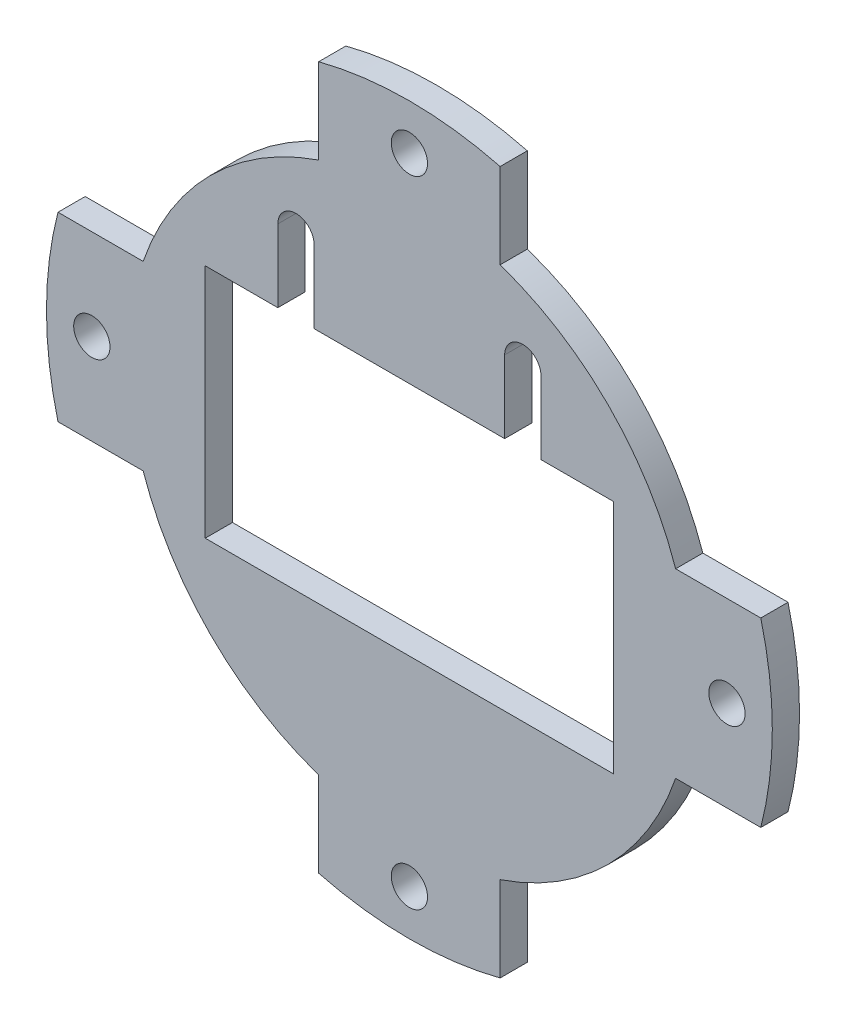
ISO-10303-21;
HEADER;
FILE_DESCRIPTION(('STEP AP214'),'2;1');
FILE_NAME('part.step','',(''),(''),'','','');
FILE_SCHEMA(('AUTOMOTIVE_DESIGN { 1 0 10303 214 1 1 1 1 }'));
ENDSEC;
DATA;
#1=APPLICATION_CONTEXT('core data for automotive mechanical design processes');
#2=APPLICATION_PROTOCOL_DEFINITION('international standard','automotive_design',2000,#1);
#3=PRODUCT_CONTEXT('',#1,'mechanical');
#4=PRODUCT('Part','Part','',(#3));
#5=PRODUCT_RELATED_PRODUCT_CATEGORY('part','',(#4));
#6=PRODUCT_DEFINITION_FORMATION('','',#4);
#7=PRODUCT_DEFINITION_CONTEXT('part definition',#1,'design');
#8=PRODUCT_DEFINITION('design','',#6,#7);
#9=PRODUCT_DEFINITION_SHAPE('','',#8);
#10=(LENGTH_UNIT() NAMED_UNIT(*) SI_UNIT(.MILLI.,.METRE.));
#11=(NAMED_UNIT(*) PLANE_ANGLE_UNIT() SI_UNIT($,.RADIAN.));
#12=(NAMED_UNIT(*) SI_UNIT($,.STERADIAN.) SOLID_ANGLE_UNIT());
#13=UNCERTAINTY_MEASURE_WITH_UNIT(LENGTH_MEASURE(1.E-05),#10,'distance_accuracy_value','');
#14=(GEOMETRIC_REPRESENTATION_CONTEXT(3) GLOBAL_UNCERTAINTY_ASSIGNED_CONTEXT((#13)) GLOBAL_UNIT_ASSIGNED_CONTEXT((#10,
#11,#12)) REPRESENTATION_CONTEXT('',''));
#15=CARTESIAN_POINT('',(0.,0.,0.));
#16=DIRECTION('',(0.,0.,1.));
#17=DIRECTION('',(1.,0.,0.));
#18=AXIS2_PLACEMENT_3D('',#15,#16,#17);
#19=CARTESIAN_POINT('',(22.5,13.,-0.00100000000000013));
#20=DIRECTION('',(0.,1.,0.));
#21=DIRECTION('',(-1.,0.,0.));
#22=AXIS2_PLACEMENT_3D('',#19,#20,#21);
#23=PLANE('',#22);
#24=DIRECTION('',(-1.,0.,0.));
#25=VECTOR('',#24,1.);
#26=CARTESIAN_POINT('',(22.5,13.,3.));
#27=LINE('',#26,#25);
#28=CARTESIAN_POINT('',(10.5,13.,3.));
#29=VERTEX_POINT('',#28);
#30=CARTESIAN_POINT('',(-10.5,13.,3.));
#31=VERTEX_POINT('',#30);
#32=EDGE_CURVE('E302',#29,#31,#27,.T.);
#33=ORIENTED_EDGE('',*,*,#32,.T.);
#34=DIRECTION('',(0.,0.,1.));
#35=VECTOR('',#34,1.);
#36=CARTESIAN_POINT('',(-10.5,13.,-0.00100000000000013));
#37=LINE('',#36,#35);
#38=CARTESIAN_POINT('',(-10.5,13.,0.));
#39=VERTEX_POINT('',#38);
#40=EDGE_CURVE('E259',#39,#31,#37,.T.);
#41=ORIENTED_EDGE('',*,*,#40,.F.);
#42=DIRECTION('',(1.,0.,0.));
#43=VECTOR('',#42,1.);
#44=CARTESIAN_POINT('',(22.5,13.,0.));
#45=LINE('',#44,#43);
#46=CARTESIAN_POINT('',(10.5,13.,0.));
#47=VERTEX_POINT('',#46);
#48=EDGE_CURVE('E286',#39,#47,#45,.T.);
#49=ORIENTED_EDGE('',*,*,#48,.T.);
#50=DIRECTION('',(0.,0.,1.));
#51=VECTOR('',#50,1.);
#52=CARTESIAN_POINT('',(10.5,13.,-0.00100000000000013));
#53=LINE('',#52,#51);
#54=EDGE_CURVE('E278',#47,#29,#53,.T.);
#55=ORIENTED_EDGE('',*,*,#54,.T.);
#56=EDGE_LOOP('',(#33,#41,#49,#55));
#57=FACE_BOUND('',#56,.T.);
#58=ADVANCED_FACE('F33',(#57),#23,.F.);
#59=CARTESIAN_POINT('',(22.5,13.,3.));
#60=VERTEX_POINT('',#59);
#61=CARTESIAN_POINT('',(14.5,13.,3.));
#62=VERTEX_POINT('',#61);
#63=EDGE_CURVE('E298',#60,#62,#27,.T.);
#64=ORIENTED_EDGE('',*,*,#63,.T.);
#65=DIRECTION('',(0.,0.,1.));
#66=VECTOR('',#65,1.);
#67=CARTESIAN_POINT('',(14.5,13.,-0.00100000000000013));
#68=LINE('',#67,#66);
#69=CARTESIAN_POINT('',(14.5,13.,0.));
#70=VERTEX_POINT('',#69);
#71=EDGE_CURVE('E276',#70,#62,#68,.T.);
#72=ORIENTED_EDGE('',*,*,#71,.F.);
#73=CARTESIAN_POINT('',(22.5,13.,0.));
#74=VERTEX_POINT('',#73);
#75=EDGE_CURVE('E282',#70,#74,#45,.T.);
#76=ORIENTED_EDGE('',*,*,#75,.T.);
#77=DIRECTION('',(0.,0.,1.));
#78=VECTOR('',#77,1.);
#79=CARTESIAN_POINT('',(22.5,13.,-0.00100000000000013));
#80=LINE('',#79,#78);
#81=EDGE_CURVE('E307',#74,#60,#80,.T.);
#82=ORIENTED_EDGE('',*,*,#81,.T.);
#83=EDGE_LOOP('',(#64,#72,#76,#82));
#84=FACE_BOUND('',#83,.T.);
#85=ADVANCED_FACE('F452',(#84),#23,.F.);
#86=CARTESIAN_POINT('',(0.,0.,3.));
#87=DIRECTION('',(0.,0.,-1.));
#88=DIRECTION('',(-1.,0.,0.));
#89=AXIS2_PLACEMENT_3D('',#86,#87,#88);
#90=CYLINDRICAL_SURFACE('',#89,40.);
#91=CARTESIAN_POINT('',(0.,0.,0.));
#92=DIRECTION('',(0.,0.,1.));
#93=DIRECTION('',(1.,0.,0.));
#94=AXIS2_PLACEMENT_3D('',#91,#92,#93);
#95=CIRCLE('',#94,40.);
#96=CARTESIAN_POINT('',(10.,38.7298334620742,0.));
#97=VERTEX_POINT('',#96);
#98=CARTESIAN_POINT('',(-10.,38.7298334620742,0.));
#99=VERTEX_POINT('',#98);
#100=EDGE_CURVE('E315',#97,#99,#95,.T.);
#101=ORIENTED_EDGE('',*,*,#100,.T.);
#102=DIRECTION('',(0.,0.,-1.));
#103=VECTOR('',#102,1.);
#104=CARTESIAN_POINT('',(-10.,38.7298334620742,3.));
#105=LINE('',#104,#103);
#106=CARTESIAN_POINT('',(-10.,38.7298334620742,3.));
#107=VERTEX_POINT('',#106);
#108=EDGE_CURVE('E11',#107,#99,#105,.T.);
#109=ORIENTED_EDGE('',*,*,#108,.F.);
#110=CARTESIAN_POINT('',(0.,0.,3.));
#111=DIRECTION('',(0.,0.,1.));
#112=DIRECTION('',(1.,0.,0.));
#113=AXIS2_PLACEMENT_3D('',#110,#111,#112);
#114=CIRCLE('',#113,40.);
#115=CARTESIAN_POINT('',(10.,38.7298334620742,3.));
#116=VERTEX_POINT('',#115);
#117=EDGE_CURVE('E316',#116,#107,#114,.T.);
#118=ORIENTED_EDGE('',*,*,#117,.F.);
#119=DIRECTION('',(0.,0.,-1.));
#120=VECTOR('',#119,1.);
#121=CARTESIAN_POINT('',(10.,38.7298334620742,3.));
#122=LINE('',#121,#120);
#123=EDGE_CURVE('E350',#116,#97,#122,.T.);
#124=ORIENTED_EDGE('',*,*,#123,.T.);
#125=EDGE_LOOP('',(#101,#109,#118,#124));
#126=FACE_BOUND('',#125,.T.);
#127=ADVANCED_FACE('F35',(#126),#90,.T.);
#128=CARTESIAN_POINT('',(-10.,29.3428015022424,3.));
#129=DIRECTION('',(1.,0.,0.));
#130=DIRECTION('',(0.,0.,-1.));
#131=AXIS2_PLACEMENT_3D('',#128,#129,#130);
#132=PLANE('',#131);
#133=DIRECTION('',(0.,-1.,0.));
#134=VECTOR('',#133,1.);
#135=CARTESIAN_POINT('',(-10.,29.3428015022424,0.));
#136=LINE('',#135,#134);
#137=CARTESIAN_POINT('',(-10.,29.3428015022424,0.));
#138=VERTEX_POINT('',#137);
#139=EDGE_CURVE('E353',#99,#138,#136,.T.);
#140=ORIENTED_EDGE('',*,*,#139,.T.);
#141=DIRECTION('',(0.,0.,-1.));
#142=VECTOR('',#141,1.);
#143=CARTESIAN_POINT('',(-10.,29.3428015022424,3.));
#144=LINE('',#143,#142);
#145=CARTESIAN_POINT('',(-10.,29.3428015022424,3.));
#146=VERTEX_POINT('',#145);
#147=EDGE_CURVE('E42',#146,#138,#144,.T.);
#148=ORIENTED_EDGE('',*,*,#147,.F.);
#149=DIRECTION('',(0.,-1.,0.));
#150=VECTOR('',#149,1.);
#151=CARTESIAN_POINT('',(-10.,29.3428015022424,3.));
#152=LINE('',#151,#150);
#153=EDGE_CURVE('E319',#107,#146,#152,.T.);
#154=ORIENTED_EDGE('',*,*,#153,.F.);
#155=ORIENTED_EDGE('',*,*,#108,.T.);
#156=EDGE_LOOP('',(#140,#148,#154,#155));
#157=FACE_BOUND('',#156,.T.);
#158=ADVANCED_FACE('F601',(#157),#132,.F.);
#159=CARTESIAN_POINT('',(0.,0.,3.));
#160=DIRECTION('',(0.,0.,-1.));
#161=DIRECTION('',(-1.,0.,0.));
#162=AXIS2_PLACEMENT_3D('',#159,#160,#161);
#163=CYLINDRICAL_SURFACE('',#162,31.);
#164=CARTESIAN_POINT('',(0.,0.,0.));
#165=DIRECTION('',(0.,0.,1.));
#166=DIRECTION('',(1.,0.,0.));
#167=AXIS2_PLACEMENT_3D('',#164,#165,#166);
#168=CIRCLE('',#167,31.);
#169=CARTESIAN_POINT('',(-29.3428015022423,10.0000000000003,0.));
#170=VERTEX_POINT('',#169);
#171=EDGE_CURVE('E355',#138,#170,#168,.T.);
#172=ORIENTED_EDGE('',*,*,#171,.T.);
#173=DIRECTION('',(0.,0.,-1.));
#174=VECTOR('',#173,1.);
#175=CARTESIAN_POINT('',(-29.3428015022423,10.0000000000003,3.));
#176=LINE('',#175,#174);
#177=CARTESIAN_POINT('',(-29.3428015022423,10.0000000000003,3.));
#178=VERTEX_POINT('',#177);
#179=EDGE_CURVE('E420',#178,#170,#176,.T.);
#180=ORIENTED_EDGE('',*,*,#179,.F.);
#181=CARTESIAN_POINT('',(0.,0.,3.));
#182=DIRECTION('',(0.,0.,1.));
#183=DIRECTION('',(1.,0.,0.));
#184=AXIS2_PLACEMENT_3D('',#181,#182,#183);
#185=CIRCLE('',#184,31.);
#186=EDGE_CURVE('E322',#146,#178,#185,.T.);
#187=ORIENTED_EDGE('',*,*,#186,.F.);
#188=ORIENTED_EDGE('',*,*,#147,.T.);
#189=EDGE_LOOP('',(#172,#180,#187,#188));
#190=FACE_BOUND('',#189,.T.);
#191=ADVANCED_FACE('F598',(#190),#163,.T.);
#192=CARTESIAN_POINT('',(-29.3428015022423,10.0000000000003,3.));
#193=DIRECTION('',(0.,-1.,0.));
#194=DIRECTION('',(1.,0.,0.));
#195=AXIS2_PLACEMENT_3D('',#192,#193,#194);
#196=PLANE('',#195);
#197=DIRECTION('',(-1.,0.,0.));
#198=VECTOR('',#197,1.);
#199=CARTESIAN_POINT('',(-29.3428015022423,10.0000000000003,0.));
#200=LINE('',#199,#198);
#201=CARTESIAN_POINT('',(-38.7298334620741,10.0000000000004,0.));
#202=VERTEX_POINT('',#201);
#203=EDGE_CURVE('E357',#170,#202,#200,.T.);
#204=ORIENTED_EDGE('',*,*,#203,.T.);
#205=DIRECTION('',(0.,0.,-1.));
#206=VECTOR('',#205,1.);
#207=CARTESIAN_POINT('',(-38.7298334620741,10.0000000000004,3.));
#208=LINE('',#207,#206);
#209=CARTESIAN_POINT('',(-38.7298334620741,10.0000000000004,3.));
#210=VERTEX_POINT('',#209);
#211=EDGE_CURVE('E417',#210,#202,#208,.T.);
#212=ORIENTED_EDGE('',*,*,#211,.F.);
#213=DIRECTION('',(-1.,0.,0.));
#214=VECTOR('',#213,1.);
#215=CARTESIAN_POINT('',(-29.3428015022423,10.0000000000003,3.));
#216=LINE('',#215,#214);
#217=EDGE_CURVE('E324',#178,#210,#216,.T.);
#218=ORIENTED_EDGE('',*,*,#217,.F.);
#219=ORIENTED_EDGE('',*,*,#179,.T.);
#220=EDGE_LOOP('',(#204,#212,#218,#219));
#221=FACE_BOUND('',#220,.T.);
#222=ADVANCED_FACE('F594',(#221),#196,.F.);
#223=CARTESIAN_POINT('',(0.,0.,3.));
#224=DIRECTION('',(0.,0.,-1.));
#225=DIRECTION('',(-1.,0.,0.));
#226=AXIS2_PLACEMENT_3D('',#223,#224,#225);
#227=CYLINDRICAL_SURFACE('',#226,40.);
#228=CARTESIAN_POINT('',(0.,0.,0.));
#229=DIRECTION('',(0.,0.,1.));
#230=DIRECTION('',(1.,0.,0.));
#231=AXIS2_PLACEMENT_3D('',#228,#229,#230);
#232=CIRCLE('',#231,40.);
#233=CARTESIAN_POINT('',(-38.7298334620743,-9.99999999999959,0.));
#234=VERTEX_POINT('',#233);
#235=EDGE_CURVE('E359',#202,#234,#232,.T.);
#236=ORIENTED_EDGE('',*,*,#235,.T.);
#237=DIRECTION('',(0.,0.,-1.));
#238=VECTOR('',#237,1.);
#239=CARTESIAN_POINT('',(-38.7298334620743,-9.99999999999959,3.));
#240=LINE('',#239,#238);
#241=CARTESIAN_POINT('',(-38.7298334620743,-9.99999999999959,3.));
#242=VERTEX_POINT('',#241);
#243=EDGE_CURVE('E414',#242,#234,#240,.T.);
#244=ORIENTED_EDGE('',*,*,#243,.F.);
#245=CARTESIAN_POINT('',(0.,0.,3.));
#246=DIRECTION('',(0.,0.,1.));
#247=DIRECTION('',(1.,0.,0.));
#248=AXIS2_PLACEMENT_3D('',#245,#246,#247);
#249=CIRCLE('',#248,40.);
#250=EDGE_CURVE('E326',#210,#242,#249,.T.);
#251=ORIENTED_EDGE('',*,*,#250,.F.);
#252=ORIENTED_EDGE('',*,*,#211,.T.);
#253=EDGE_LOOP('',(#236,#244,#251,#252));
#254=FACE_BOUND('',#253,.T.);
#255=ADVANCED_FACE('F590',(#254),#227,.T.);
#256=CARTESIAN_POINT('',(-29.3428015022425,-9.9999999999997,3.));
#257=DIRECTION('',(0.,1.,0.));
#258=DIRECTION('',(-1.,0.,0.));
#259=AXIS2_PLACEMENT_3D('',#256,#257,#258);
#260=PLANE('',#259);
#261=DIRECTION('',(1.,0.,0.));
#262=VECTOR('',#261,1.);
#263=CARTESIAN_POINT('',(-29.3428015022425,-9.9999999999997,0.));
#264=LINE('',#263,#262);
#265=CARTESIAN_POINT('',(-29.3428015022425,-9.9999999999997,0.));
#266=VERTEX_POINT('',#265);
#267=EDGE_CURVE('E361',#234,#266,#264,.T.);
#268=ORIENTED_EDGE('',*,*,#267,.T.);
#269=DIRECTION('',(0.,0.,-1.));
#270=VECTOR('',#269,1.);
#271=CARTESIAN_POINT('',(-29.3428015022425,-9.9999999999997,3.));
#272=LINE('',#271,#270);
#273=CARTESIAN_POINT('',(-29.3428015022425,-9.9999999999997,3.));
#274=VERTEX_POINT('',#273);
#275=EDGE_CURVE('E411',#274,#266,#272,.T.);
#276=ORIENTED_EDGE('',*,*,#275,.F.);
#277=DIRECTION('',(1.,0.,0.));
#278=VECTOR('',#277,1.);
#279=CARTESIAN_POINT('',(-29.3428015022425,-9.9999999999997,3.));
#280=LINE('',#279,#278);
#281=EDGE_CURVE('E328',#242,#274,#280,.T.);
#282=ORIENTED_EDGE('',*,*,#281,.F.);
#283=ORIENTED_EDGE('',*,*,#243,.T.);
#284=EDGE_LOOP('',(#268,#276,#282,#283));
#285=FACE_BOUND('',#284,.T.);
#286=ADVANCED_FACE('F586',(#285),#260,.F.);
#287=CARTESIAN_POINT('',(0.,0.,3.));
#288=DIRECTION('',(0.,0.,-1.));
#289=DIRECTION('',(-1.,0.,0.));
#290=AXIS2_PLACEMENT_3D('',#287,#288,#289);
#291=CYLINDRICAL_SURFACE('',#290,31.);
#292=CARTESIAN_POINT('',(0.,0.,0.));
#293=DIRECTION('',(0.,0.,1.));
#294=DIRECTION('',(1.,0.,0.));
#295=AXIS2_PLACEMENT_3D('',#292,#293,#294);
#296=CIRCLE('',#295,31.);
#297=CARTESIAN_POINT('',(-10.0000000000002,-29.3428015022423,0.));
#298=VERTEX_POINT('',#297);
#299=EDGE_CURVE('E363',#266,#298,#296,.T.);
#300=ORIENTED_EDGE('',*,*,#299,.T.);
#301=DIRECTION('',(0.,0.,-1.));
#302=VECTOR('',#301,1.);
#303=CARTESIAN_POINT('',(-10.0000000000002,-29.3428015022423,3.));
#304=LINE('',#303,#302);
#305=CARTESIAN_POINT('',(-10.0000000000002,-29.3428015022423,3.));
#306=VERTEX_POINT('',#305);
#307=EDGE_CURVE('E408',#306,#298,#304,.T.);
#308=ORIENTED_EDGE('',*,*,#307,.F.);
#309=CARTESIAN_POINT('',(0.,0.,3.));
#310=DIRECTION('',(0.,0.,1.));
#311=DIRECTION('',(1.,0.,0.));
#312=AXIS2_PLACEMENT_3D('',#309,#310,#311);
#313=CIRCLE('',#312,31.);
#314=EDGE_CURVE('E330',#274,#306,#313,.T.);
#315=ORIENTED_EDGE('',*,*,#314,.F.);
#316=ORIENTED_EDGE('',*,*,#275,.T.);
#317=EDGE_LOOP('',(#300,#308,#315,#316));
#318=FACE_BOUND('',#317,.T.);
#319=ADVANCED_FACE('F582',(#318),#291,.T.);
#320=CARTESIAN_POINT('',(-10.0000000000002,-29.3428015022423,3.));
#321=DIRECTION('',(1.,0.,0.));
#322=DIRECTION('',(0.,1.,0.));
#323=AXIS2_PLACEMENT_3D('',#320,#321,#322);
#324=PLANE('',#323);
#325=DIRECTION('',(0.,-1.,0.));
#326=VECTOR('',#325,1.);
#327=CARTESIAN_POINT('',(-10.0000000000002,-29.3428015022423,0.));
#328=LINE('',#327,#326);
#329=CARTESIAN_POINT('',(-10.0000000000003,-38.7298334620741,0.));
#330=VERTEX_POINT('',#329);
#331=EDGE_CURVE('E365',#298,#330,#328,.T.);
#332=ORIENTED_EDGE('',*,*,#331,.T.);
#333=DIRECTION('',(0.,0.,-1.));
#334=VECTOR('',#333,1.);
#335=CARTESIAN_POINT('',(-10.0000000000003,-38.7298334620741,3.));
#336=LINE('',#335,#334);
#337=CARTESIAN_POINT('',(-10.0000000000003,-38.7298334620741,3.));
#338=VERTEX_POINT('',#337);
#339=EDGE_CURVE('E405',#338,#330,#336,.T.);
#340=ORIENTED_EDGE('',*,*,#339,.F.);
#341=DIRECTION('',(0.,-1.,0.));
#342=VECTOR('',#341,1.);
#343=CARTESIAN_POINT('',(-10.0000000000002,-29.3428015022423,3.));
#344=LINE('',#343,#342);
#345=EDGE_CURVE('E332',#306,#338,#344,.T.);
#346=ORIENTED_EDGE('',*,*,#345,.F.);
#347=ORIENTED_EDGE('',*,*,#307,.T.);
#348=EDGE_LOOP('',(#332,#340,#346,#347));
#349=FACE_BOUND('',#348,.T.);
#350=ADVANCED_FACE('F578',(#349),#324,.F.);
#351=CARTESIAN_POINT('',(0.,0.,3.));
#352=DIRECTION('',(0.,0.,-1.));
#353=DIRECTION('',(-1.,0.,0.));
#354=AXIS2_PLACEMENT_3D('',#351,#352,#353);
#355=CYLINDRICAL_SURFACE('',#354,40.);
#356=CARTESIAN_POINT('',(0.,0.,0.));
#357=DIRECTION('',(0.,0.,1.));
#358=DIRECTION('',(1.,0.,0.));
#359=AXIS2_PLACEMENT_3D('',#356,#357,#358);
#360=CIRCLE('',#359,40.);
#361=CARTESIAN_POINT('',(9.99999999999972,-38.7298334620742,0.));
#362=VERTEX_POINT('',#361);
#363=EDGE_CURVE('E367',#330,#362,#360,.T.);
#364=ORIENTED_EDGE('',*,*,#363,.T.);
#365=DIRECTION('',(0.,0.,-1.));
#366=VECTOR('',#365,1.);
#367=CARTESIAN_POINT('',(9.99999999999972,-38.7298334620742,3.));
#368=LINE('',#367,#366);
#369=CARTESIAN_POINT('',(9.99999999999972,-38.7298334620742,3.));
#370=VERTEX_POINT('',#369);
#371=EDGE_CURVE('E402',#370,#362,#368,.T.);
#372=ORIENTED_EDGE('',*,*,#371,.F.);
#373=CARTESIAN_POINT('',(0.,0.,3.));
#374=DIRECTION('',(0.,0.,1.));
#375=DIRECTION('',(1.,0.,0.));
#376=AXIS2_PLACEMENT_3D('',#373,#374,#375);
#377=CIRCLE('',#376,40.);
#378=EDGE_CURVE('E334',#338,#370,#377,.T.);
#379=ORIENTED_EDGE('',*,*,#378,.F.);
#380=ORIENTED_EDGE('',*,*,#339,.T.);
#381=EDGE_LOOP('',(#364,#372,#379,#380));
#382=FACE_BOUND('',#381,.T.);
#383=ADVANCED_FACE('F574',(#382),#355,.T.);
#384=CARTESIAN_POINT('',(9.9999999999998,-29.3428015022425,3.));
#385=DIRECTION('',(-1.,0.,0.));
#386=DIRECTION('',(0.,-1.,0.));
#387=AXIS2_PLACEMENT_3D('',#384,#385,#386);
#388=PLANE('',#387);
#389=DIRECTION('',(0.,1.,0.));
#390=VECTOR('',#389,1.);
#391=CARTESIAN_POINT('',(9.9999999999998,-29.3428015022425,0.));
#392=LINE('',#391,#390);
#393=CARTESIAN_POINT('',(9.9999999999998,-29.3428015022425,0.));
#394=VERTEX_POINT('',#393);
#395=EDGE_CURVE('E369',#362,#394,#392,.T.);
#396=ORIENTED_EDGE('',*,*,#395,.T.);
#397=DIRECTION('',(0.,0.,-1.));
#398=VECTOR('',#397,1.);
#399=CARTESIAN_POINT('',(9.9999999999998,-29.3428015022425,3.));
#400=LINE('',#399,#398);
#401=CARTESIAN_POINT('',(9.9999999999998,-29.3428015022425,3.));
#402=VERTEX_POINT('',#401);
#403=EDGE_CURVE('E399',#402,#394,#400,.T.);
#404=ORIENTED_EDGE('',*,*,#403,.F.);
#405=DIRECTION('',(0.,1.,0.));
#406=VECTOR('',#405,1.);
#407=CARTESIAN_POINT('',(9.9999999999998,-29.3428015022425,3.));
#408=LINE('',#407,#406);
#409=EDGE_CURVE('E336',#370,#402,#408,.T.);
#410=ORIENTED_EDGE('',*,*,#409,.F.);
#411=ORIENTED_EDGE('',*,*,#371,.T.);
#412=EDGE_LOOP('',(#396,#404,#410,#411));
#413=FACE_BOUND('',#412,.T.);
#414=ADVANCED_FACE('F570',(#413),#388,.F.);
#415=CARTESIAN_POINT('',(0.,0.,3.));
#416=DIRECTION('',(0.,0.,-1.));
#417=DIRECTION('',(-1.,0.,0.));
#418=AXIS2_PLACEMENT_3D('',#415,#416,#417);
#419=CYLINDRICAL_SURFACE('',#418,31.);
#420=CARTESIAN_POINT('',(0.,0.,0.));
#421=DIRECTION('',(0.,0.,1.));
#422=DIRECTION('',(1.,0.,0.));
#423=AXIS2_PLACEMENT_3D('',#420,#421,#422);
#424=CIRCLE('',#423,31.);
#425=CARTESIAN_POINT('',(29.3428015022424,-10.0000000000001,0.));
#426=VERTEX_POINT('',#425);
#427=EDGE_CURVE('E371',#394,#426,#424,.T.);
#428=ORIENTED_EDGE('',*,*,#427,.T.);
#429=DIRECTION('',(0.,0.,-1.));
#430=VECTOR('',#429,1.);
#431=CARTESIAN_POINT('',(29.3428015022424,-10.0000000000001,3.));
#432=LINE('',#431,#430);
#433=CARTESIAN_POINT('',(29.3428015022424,-10.0000000000001,3.));
#434=VERTEX_POINT('',#433);
#435=EDGE_CURVE('E396',#434,#426,#432,.T.);
#436=ORIENTED_EDGE('',*,*,#435,.F.);
#437=CARTESIAN_POINT('',(0.,0.,3.));
#438=DIRECTION('',(0.,0.,1.));
#439=DIRECTION('',(1.,0.,0.));
#440=AXIS2_PLACEMENT_3D('',#437,#438,#439);
#441=CIRCLE('',#440,31.);
#442=EDGE_CURVE('E338',#402,#434,#441,.T.);
#443=ORIENTED_EDGE('',*,*,#442,.F.);
#444=ORIENTED_EDGE('',*,*,#403,.T.);
#445=EDGE_LOOP('',(#428,#436,#443,#444));
#446=FACE_BOUND('',#445,.T.);
#447=ADVANCED_FACE('F566',(#446),#419,.T.);
#448=CARTESIAN_POINT('',(29.3428015022424,-10.0000000000001,3.));
#449=DIRECTION('',(0.,1.,0.));
#450=DIRECTION('',(-1.,0.,0.));
#451=AXIS2_PLACEMENT_3D('',#448,#449,#450);
#452=PLANE('',#451);
#453=DIRECTION('',(1.,0.,0.));
#454=VECTOR('',#453,1.);
#455=CARTESIAN_POINT('',(29.3428015022424,-10.0000000000001,0.));
#456=LINE('',#455,#454);
#457=CARTESIAN_POINT('',(38.7298334620741,-10.0000000000001,0.));
#458=VERTEX_POINT('',#457);
#459=EDGE_CURVE('E373',#426,#458,#456,.T.);
#460=ORIENTED_EDGE('',*,*,#459,.T.);
#461=DIRECTION('',(0.,0.,-1.));
#462=VECTOR('',#461,1.);
#463=CARTESIAN_POINT('',(38.7298334620741,-10.0000000000001,3.));
#464=LINE('',#463,#462);
#465=CARTESIAN_POINT('',(38.7298334620741,-10.0000000000001,3.));
#466=VERTEX_POINT('',#465);
#467=EDGE_CURVE('E393',#466,#458,#464,.T.);
#468=ORIENTED_EDGE('',*,*,#467,.F.);
#469=DIRECTION('',(1.,0.,0.));
#470=VECTOR('',#469,1.);
#471=CARTESIAN_POINT('',(29.3428015022424,-10.0000000000001,3.));
#472=LINE('',#471,#470);
#473=EDGE_CURVE('E340',#434,#466,#472,.T.);
#474=ORIENTED_EDGE('',*,*,#473,.F.);
#475=ORIENTED_EDGE('',*,*,#435,.T.);
#476=EDGE_LOOP('',(#460,#468,#474,#475));
#477=FACE_BOUND('',#476,.T.);
#478=ADVANCED_FACE('F562',(#477),#452,.F.);
#479=CARTESIAN_POINT('',(0.,0.,3.));
#480=DIRECTION('',(0.,0.,-1.));
#481=DIRECTION('',(-1.,0.,0.));
#482=AXIS2_PLACEMENT_3D('',#479,#480,#481);
#483=CYLINDRICAL_SURFACE('',#482,40.);
#484=CARTESIAN_POINT('',(0.,0.,0.));
#485=DIRECTION('',(0.,0.,1.));
#486=DIRECTION('',(1.,0.,0.));
#487=AXIS2_PLACEMENT_3D('',#484,#485,#486);
#488=CIRCLE('',#487,40.);
#489=CARTESIAN_POINT('',(38.7298334620742,9.99999999999987,0.));
#490=VERTEX_POINT('',#489);
#491=EDGE_CURVE('E375',#458,#490,#488,.T.);
#492=ORIENTED_EDGE('',*,*,#491,.T.);
#493=DIRECTION('',(0.,0.,-1.));
#494=VECTOR('',#493,1.);
#495=CARTESIAN_POINT('',(38.7298334620742,9.99999999999987,3.));
#496=LINE('',#495,#494);
#497=CARTESIAN_POINT('',(38.7298334620742,9.99999999999987,3.));
#498=VERTEX_POINT('',#497);
#499=EDGE_CURVE('E390',#498,#490,#496,.T.);
#500=ORIENTED_EDGE('',*,*,#499,.F.);
#501=CARTESIAN_POINT('',(0.,0.,3.));
#502=DIRECTION('',(0.,0.,1.));
#503=DIRECTION('',(1.,0.,0.));
#504=AXIS2_PLACEMENT_3D('',#501,#502,#503);
#505=CIRCLE('',#504,40.);
#506=EDGE_CURVE('E342',#466,#498,#505,.T.);
#507=ORIENTED_EDGE('',*,*,#506,.F.);
#508=ORIENTED_EDGE('',*,*,#467,.T.);
#509=EDGE_LOOP('',(#492,#500,#507,#508));
#510=FACE_BOUND('',#509,.T.);
#511=ADVANCED_FACE('F558',(#510),#483,.T.);
#512=CARTESIAN_POINT('',(29.3428015022425,9.9999999999999,3.));
#513=DIRECTION('',(0.,-1.,0.));
#514=DIRECTION('',(1.,0.,0.));
#515=AXIS2_PLACEMENT_3D('',#512,#513,#514);
#516=PLANE('',#515);
#517=DIRECTION('',(-1.,0.,0.));
#518=VECTOR('',#517,1.);
#519=CARTESIAN_POINT('',(29.3428015022425,9.9999999999999,0.));
#520=LINE('',#519,#518);
#521=CARTESIAN_POINT('',(29.3428015022425,9.9999999999999,0.));
#522=VERTEX_POINT('',#521);
#523=EDGE_CURVE('E377',#490,#522,#520,.T.);
#524=ORIENTED_EDGE('',*,*,#523,.T.);
#525=DIRECTION('',(0.,0.,-1.));
#526=VECTOR('',#525,1.);
#527=CARTESIAN_POINT('',(29.3428015022425,9.9999999999999,3.));
#528=LINE('',#527,#526);
#529=CARTESIAN_POINT('',(29.3428015022425,9.9999999999999,3.));
#530=VERTEX_POINT('',#529);
#531=EDGE_CURVE('E387',#530,#522,#528,.T.);
#532=ORIENTED_EDGE('',*,*,#531,.F.);
#533=DIRECTION('',(-1.,0.,0.));
#534=VECTOR('',#533,1.);
#535=CARTESIAN_POINT('',(29.3428015022425,9.9999999999999,3.));
#536=LINE('',#535,#534);
#537=EDGE_CURVE('E344',#498,#530,#536,.T.);
#538=ORIENTED_EDGE('',*,*,#537,.F.);
#539=ORIENTED_EDGE('',*,*,#499,.T.);
#540=EDGE_LOOP('',(#524,#532,#538,#539));
#541=FACE_BOUND('',#540,.T.);
#542=ADVANCED_FACE('F554',(#541),#516,.F.);
#543=CARTESIAN_POINT('',(0.,0.,3.));
#544=DIRECTION('',(0.,0.,-1.));
#545=DIRECTION('',(-1.,0.,0.));
#546=AXIS2_PLACEMENT_3D('',#543,#544,#545);
#547=CYLINDRICAL_SURFACE('',#546,31.);
#548=CARTESIAN_POINT('',(0.,0.,0.));
#549=DIRECTION('',(0.,0.,1.));
#550=DIRECTION('',(1.,0.,0.));
#551=AXIS2_PLACEMENT_3D('',#548,#549,#550);
#552=CIRCLE('',#551,31.);
#553=CARTESIAN_POINT('',(10.,29.3428015022424,0.));
#554=VERTEX_POINT('',#553);
#555=EDGE_CURVE('E379',#522,#554,#552,.T.);
#556=ORIENTED_EDGE('',*,*,#555,.T.);
#557=DIRECTION('',(0.,0.,-1.));
#558=VECTOR('',#557,1.);
#559=CARTESIAN_POINT('',(10.,29.3428015022424,3.));
#560=LINE('',#559,#558);
#561=CARTESIAN_POINT('',(10.,29.3428015022424,3.));
#562=VERTEX_POINT('',#561);
#563=EDGE_CURVE('E384',#562,#554,#560,.T.);
#564=ORIENTED_EDGE('',*,*,#563,.F.);
#565=CARTESIAN_POINT('',(0.,0.,3.));
#566=DIRECTION('',(0.,0.,1.));
#567=DIRECTION('',(1.,0.,0.));
#568=AXIS2_PLACEMENT_3D('',#565,#566,#567);
#569=CIRCLE('',#568,31.);
#570=EDGE_CURVE('E346',#530,#562,#569,.T.);
#571=ORIENTED_EDGE('',*,*,#570,.F.);
#572=ORIENTED_EDGE('',*,*,#531,.T.);
#573=EDGE_LOOP('',(#556,#564,#571,#572));
#574=FACE_BOUND('',#573,.T.);
#575=ADVANCED_FACE('F550',(#574),#547,.T.);
#576=CARTESIAN_POINT('',(10.,29.3428015022424,3.));
#577=DIRECTION('',(-1.,0.,0.));
#578=DIRECTION('',(0.,0.,1.));
#579=AXIS2_PLACEMENT_3D('',#576,#577,#578);
#580=PLANE('',#579);
#581=DIRECTION('',(0.,1.,0.));
#582=VECTOR('',#581,1.);
#583=CARTESIAN_POINT('',(10.,29.3428015022424,0.));
#584=LINE('',#583,#582);
#585=EDGE_CURVE('E320',#554,#97,#584,.T.);
#586=ORIENTED_EDGE('',*,*,#585,.T.);
#587=ORIENTED_EDGE('',*,*,#123,.F.);
#588=DIRECTION('',(0.,1.,0.));
#589=VECTOR('',#588,1.);
#590=CARTESIAN_POINT('',(10.,29.3428015022424,3.));
#591=LINE('',#590,#589);
#592=EDGE_CURVE('E348',#562,#116,#591,.T.);
#593=ORIENTED_EDGE('',*,*,#592,.F.);
#594=ORIENTED_EDGE('',*,*,#563,.T.);
#595=EDGE_LOOP('',(#586,#587,#593,#594));
#596=FACE_BOUND('',#595,.T.);
#597=ADVANCED_FACE('F544',(#596),#580,.F.);
#598=CARTESIAN_POINT('',(0.,0.,3.));
#599=DIRECTION('',(0.,0.,1.));
#600=DIRECTION('',(1.,0.,0.));
#601=AXIS2_PLACEMENT_3D('',#598,#599,#600);
#602=PLANE('',#601);
#603=CARTESIAN_POINT('',(0.,35.,3.));
#604=DIRECTION('',(0.,0.,1.));
#605=DIRECTION('',(1.,0.,0.));
#606=AXIS2_PLACEMENT_3D('',#603,#604,#605);
#607=CIRCLE('',#606,2.);
#608=CARTESIAN_POINT('',(2.,35.,3.));
#609=VERTEX_POINT('',#608);
#610=EDGE_CURVE('E429',#609,#609,#607,.T.);
#611=ORIENTED_EDGE('',*,*,#610,.F.);
#612=EDGE_LOOP('',(#611));
#613=FACE_BOUND('',#612,.T.);
#614=CARTESIAN_POINT('',(35.000000000001,9.90473566267125E-13,3.));
#615=DIRECTION('',(0.,0.,1.));
#616=DIRECTION('',(1.,0.,0.));
#617=AXIS2_PLACEMENT_3D('',#614,#615,#616);
#618=CIRCLE('',#617,2.00000000000077);
#619=CARTESIAN_POINT('',(37.0000000000018,9.90473566267125E-13,3.));
#620=VERTEX_POINT('',#619);
#621=EDGE_CURVE('E851',#620,#620,#618,.T.);
#622=ORIENTED_EDGE('',*,*,#621,.F.);
#623=EDGE_LOOP('',(#622));
#624=FACE_BOUND('',#623,.T.);
#625=CARTESIAN_POINT('',(1.98094713253425E-12,-35.,3.));
#626=DIRECTION('',(0.,0.,1.));
#627=DIRECTION('',(1.,0.,0.));
#628=AXIS2_PLACEMENT_3D('',#625,#626,#627);
#629=CIRCLE('',#628,2.00000000000213);
#630=CARTESIAN_POINT('',(2.00000000000411,-35.,3.));
#631=VERTEX_POINT('',#630);
#632=EDGE_CURVE('E532',#631,#631,#629,.T.);
#633=ORIENTED_EDGE('',*,*,#632,.F.);
#634=EDGE_LOOP('',(#633));
#635=FACE_BOUND('',#634,.T.);
#636=CARTESIAN_POINT('',(-34.999999999999,-9.9475983006414E-13,3.));
#637=DIRECTION('',(0.,0.,1.));
#638=DIRECTION('',(1.,0.,0.));
#639=AXIS2_PLACEMENT_3D('',#636,#637,#638);
#640=CIRCLE('',#639,2.00000000000159);
#641=CARTESIAN_POINT('',(-32.9999999999974,-9.9475983006414E-13,3.));
#642=VERTEX_POINT('',#641);
#643=EDGE_CURVE('E251',#642,#642,#640,.T.);
#644=ORIENTED_EDGE('',*,*,#643,.F.);
#645=EDGE_LOOP('',(#644));
#646=FACE_BOUND('',#645,.T.);
#647=DIRECTION('',(0.,1.,0.));
#648=VECTOR('',#647,1.);
#649=CARTESIAN_POINT('',(-10.5,21.,3.));
#650=LINE('',#649,#648);
#651=CARTESIAN_POINT('',(-10.5,21.,3.));
#652=VERTEX_POINT('',#651);
#653=EDGE_CURVE('E229',#31,#652,#650,.T.);
#654=ORIENTED_EDGE('',*,*,#653,.F.);
#655=ORIENTED_EDGE('',*,*,#32,.F.);
#656=DIRECTION('',(0.,-1.,0.));
#657=VECTOR('',#656,1.);
#658=CARTESIAN_POINT('',(10.5,21.,3.));
#659=LINE('',#658,#657);
#660=CARTESIAN_POINT('',(10.5,21.,3.));
#661=VERTEX_POINT('',#660);
#662=EDGE_CURVE('E58',#661,#29,#659,.T.);
#663=ORIENTED_EDGE('',*,*,#662,.F.);
#664=CARTESIAN_POINT('',(12.5,21.,3.));
#665=DIRECTION('',(0.,0.,1.));
#666=DIRECTION('',(-1.,0.,0.));
#667=AXIS2_PLACEMENT_3D('',#664,#665,#666);
#668=CIRCLE('',#667,2.);
#669=CARTESIAN_POINT('',(14.5,21.,3.));
#670=VERTEX_POINT('',#669);
#671=EDGE_CURVE('E267',#670,#661,#668,.T.);
#672=ORIENTED_EDGE('',*,*,#671,.F.);
#673=DIRECTION('',(0.,1.,0.));
#674=VECTOR('',#673,1.);
#675=CARTESIAN_POINT('',(14.5,21.,3.));
#676=LINE('',#675,#674);
#677=EDGE_CURVE('E271',#62,#670,#676,.T.);
#678=ORIENTED_EDGE('',*,*,#677,.F.);
#679=ORIENTED_EDGE('',*,*,#63,.F.);
#680=DIRECTION('',(0.,1.,0.));
#681=VECTOR('',#680,1.);
#682=CARTESIAN_POINT('',(22.5,13.,3.));
#683=LINE('',#682,#681);
#684=CARTESIAN_POINT('',(22.5,-13.,3.));
#685=VERTEX_POINT('',#684);
#686=EDGE_CURVE('E294',#685,#60,#683,.T.);
#687=ORIENTED_EDGE('',*,*,#686,.F.);
#688=DIRECTION('',(1.,0.,0.));
#689=VECTOR('',#688,1.);
#690=CARTESIAN_POINT('',(22.5,-13.,3.));
#691=LINE('',#690,#689);
#692=CARTESIAN_POINT('',(-22.5,-13.,3.));
#693=VERTEX_POINT('',#692);
#694=EDGE_CURVE('E291',#693,#685,#691,.T.);
#695=ORIENTED_EDGE('',*,*,#694,.F.);
#696=DIRECTION('',(0.,-1.,0.));
#697=VECTOR('',#696,1.);
#698=CARTESIAN_POINT('',(-22.5,13.,3.));
#699=LINE('',#698,#697);
#700=CARTESIAN_POINT('',(-22.5,13.,3.));
#701=VERTEX_POINT('',#700);
#702=EDGE_CURVE('E289',#701,#693,#699,.T.);
#703=ORIENTED_EDGE('',*,*,#702,.F.);
#704=CARTESIAN_POINT('',(-14.5,13.,3.));
#705=VERTEX_POINT('',#704);
#706=EDGE_CURVE('E297',#705,#701,#27,.T.);
#707=ORIENTED_EDGE('',*,*,#706,.F.);
#708=DIRECTION('',(0.,-1.,0.));
#709=VECTOR('',#708,1.);
#710=CARTESIAN_POINT('',(-14.5,21.,3.));
#711=LINE('',#710,#709);
#712=CARTESIAN_POINT('',(-14.5,21.,3.));
#713=VERTEX_POINT('',#712);
#714=EDGE_CURVE('E50',#713,#705,#711,.T.);
#715=ORIENTED_EDGE('',*,*,#714,.F.);
#716=CARTESIAN_POINT('',(-12.5,21.,3.));
#717=DIRECTION('',(0.,0.,1.));
#718=DIRECTION('',(1.,0.,0.));
#719=AXIS2_PLACEMENT_3D('',#716,#717,#718);
#720=CIRCLE('',#719,2.);
#721=EDGE_CURVE('E227',#652,#713,#720,.T.);
#722=ORIENTED_EDGE('',*,*,#721,.F.);
#723=EDGE_LOOP('',(#654,#655,#663,#672,#678,#679,#687,#695,#703,#707,#715,#722));
#724=FACE_BOUND('',#723,.T.);
#725=ORIENTED_EDGE('',*,*,#117,.T.);
#726=ORIENTED_EDGE('',*,*,#153,.T.);
#727=ORIENTED_EDGE('',*,*,#186,.T.);
#728=ORIENTED_EDGE('',*,*,#217,.T.);
#729=ORIENTED_EDGE('',*,*,#250,.T.);
#730=ORIENTED_EDGE('',*,*,#281,.T.);
#731=ORIENTED_EDGE('',*,*,#314,.T.);
#732=ORIENTED_EDGE('',*,*,#345,.T.);
#733=ORIENTED_EDGE('',*,*,#378,.T.);
#734=ORIENTED_EDGE('',*,*,#409,.T.);
#735=ORIENTED_EDGE('',*,*,#442,.T.);
#736=ORIENTED_EDGE('',*,*,#473,.T.);
#737=ORIENTED_EDGE('',*,*,#506,.T.);
#738=ORIENTED_EDGE('',*,*,#537,.T.);
#739=ORIENTED_EDGE('',*,*,#570,.T.);
#740=ORIENTED_EDGE('',*,*,#592,.T.);
#741=EDGE_LOOP('',(#725,#726,#727,#728,#729,#730,#731,#732,#733,#734,#735,#736,#737,#738,#739,#740));
#742=FACE_BOUND('',#741,.T.);
#743=ADVANCED_FACE('F501',(#613,#624,#635,#646,#724,#742),#602,.T.);
#744=CARTESIAN_POINT('',(0.,0.,0.));
#745=DIRECTION('',(0.,0.,1.));
#746=DIRECTION('',(1.,0.,0.));
#747=AXIS2_PLACEMENT_3D('',#744,#745,#746);
#748=PLANE('',#747);
#749=CARTESIAN_POINT('',(0.,35.,0.));
#750=DIRECTION('',(0.,0.,1.));
#751=DIRECTION('',(1.,0.,0.));
#752=AXIS2_PLACEMENT_3D('',#749,#750,#751);
#753=CIRCLE('',#752,2.);
#754=CARTESIAN_POINT('',(2.,35.,0.));
#755=VERTEX_POINT('',#754);
#756=EDGE_CURVE('E37',#755,#755,#753,.T.);
#757=ORIENTED_EDGE('',*,*,#756,.T.);
#758=EDGE_LOOP('',(#757));
#759=FACE_BOUND('',#758,.T.);
#760=CARTESIAN_POINT('',(35.000000000001,9.90473566267125E-13,0.));
#761=DIRECTION('',(0.,0.,1.));
#762=DIRECTION('',(1.,0.,0.));
#763=AXIS2_PLACEMENT_3D('',#760,#761,#762);
#764=CIRCLE('',#763,2.00000000000077);
#765=CARTESIAN_POINT('',(37.0000000000018,9.90473566267125E-13,0.));
#766=VERTEX_POINT('',#765);
#767=EDGE_CURVE('E431',#766,#766,#764,.T.);
#768=ORIENTED_EDGE('',*,*,#767,.T.);
#769=EDGE_LOOP('',(#768));
#770=FACE_BOUND('',#769,.T.);
#771=CARTESIAN_POINT('',(1.98094713253425E-12,-35.,0.));
#772=DIRECTION('',(0.,0.,1.));
#773=DIRECTION('',(1.,0.,0.));
#774=AXIS2_PLACEMENT_3D('',#771,#772,#773);
#775=CIRCLE('',#774,2.00000000000213);
#776=CARTESIAN_POINT('',(2.00000000000411,-35.,0.));
#777=VERTEX_POINT('',#776);
#778=EDGE_CURVE('E428',#777,#777,#775,.T.);
#779=ORIENTED_EDGE('',*,*,#778,.T.);
#780=EDGE_LOOP('',(#779));
#781=FACE_BOUND('',#780,.T.);
#782=CARTESIAN_POINT('',(-34.999999999999,-9.9475983006414E-13,0.));
#783=DIRECTION('',(0.,0.,1.));
#784=DIRECTION('',(1.,0.,0.));
#785=AXIS2_PLACEMENT_3D('',#782,#783,#784);
#786=CIRCLE('',#785,2.00000000000159);
#787=CARTESIAN_POINT('',(-32.9999999999974,-9.9475983006414E-13,0.));
#788=VERTEX_POINT('',#787);
#789=EDGE_CURVE('E425',#788,#788,#786,.T.);
#790=ORIENTED_EDGE('',*,*,#789,.T.);
#791=EDGE_LOOP('',(#790));
#792=FACE_BOUND('',#791,.T.);
#793=ORIENTED_EDGE('',*,*,#48,.F.);
#794=DIRECTION('',(0.,-1.,0.));
#795=VECTOR('',#794,1.);
#796=CARTESIAN_POINT('',(-10.5,21.,0.));
#797=LINE('',#796,#795);
#798=CARTESIAN_POINT('',(-10.5,21.,0.));
#799=VERTEX_POINT('',#798);
#800=EDGE_CURVE('E243',#799,#39,#797,.T.);
#801=ORIENTED_EDGE('',*,*,#800,.F.);
#802=CARTESIAN_POINT('',(-12.5,21.,0.));
#803=DIRECTION('',(0.,0.,1.));
#804=DIRECTION('',(1.,0.,0.));
#805=AXIS2_PLACEMENT_3D('',#802,#803,#804);
#806=CIRCLE('',#805,2.);
#807=CARTESIAN_POINT('',(-14.5,21.,0.));
#808=VERTEX_POINT('',#807);
#809=EDGE_CURVE('E224',#808,#799,#806,.F.);
#810=ORIENTED_EDGE('',*,*,#809,.F.);
#811=DIRECTION('',(0.,1.,0.));
#812=VECTOR('',#811,1.);
#813=CARTESIAN_POINT('',(-14.5,21.,0.));
#814=LINE('',#813,#812);
#815=CARTESIAN_POINT('',(-14.5,13.,0.));
#816=VERTEX_POINT('',#815);
#817=EDGE_CURVE('E232',#816,#808,#814,.T.);
#818=ORIENTED_EDGE('',*,*,#817,.F.);
#819=CARTESIAN_POINT('',(-22.5,13.,0.));
#820=VERTEX_POINT('',#819);
#821=EDGE_CURVE('E283',#820,#816,#45,.T.);
#822=ORIENTED_EDGE('',*,*,#821,.F.);
#823=DIRECTION('',(0.,1.,0.));
#824=VECTOR('',#823,1.);
#825=CARTESIAN_POINT('',(-22.5,13.,0.));
#826=LINE('',#825,#824);
#827=CARTESIAN_POINT('',(-22.5,-13.,0.));
#828=VERTEX_POINT('',#827);
#829=EDGE_CURVE('E285',#828,#820,#826,.T.);
#830=ORIENTED_EDGE('',*,*,#829,.F.);
#831=DIRECTION('',(-1.,0.,0.));
#832=VECTOR('',#831,1.);
#833=CARTESIAN_POINT('',(22.5,-13.,0.));
#834=LINE('',#833,#832);
#835=CARTESIAN_POINT('',(22.5,-13.,0.));
#836=VERTEX_POINT('',#835);
#837=EDGE_CURVE('E306',#836,#828,#834,.T.);
#838=ORIENTED_EDGE('',*,*,#837,.F.);
#839=DIRECTION('',(0.,-1.,0.));
#840=VECTOR('',#839,1.);
#841=CARTESIAN_POINT('',(22.5,13.,0.));
#842=LINE('',#841,#840);
#843=EDGE_CURVE('E237',#74,#836,#842,.T.);
#844=ORIENTED_EDGE('',*,*,#843,.F.);
#845=ORIENTED_EDGE('',*,*,#75,.F.);
#846=DIRECTION('',(0.,-1.,0.));
#847=VECTOR('',#846,1.);
#848=CARTESIAN_POINT('',(14.5,21.,0.));
#849=LINE('',#848,#847);
#850=CARTESIAN_POINT('',(14.5,21.,0.));
#851=VERTEX_POINT('',#850);
#852=EDGE_CURVE('E265',#851,#70,#849,.T.);
#853=ORIENTED_EDGE('',*,*,#852,.F.);
#854=CARTESIAN_POINT('',(12.5,21.,0.));
#855=DIRECTION('',(0.,0.,1.));
#856=DIRECTION('',(1.,0.,0.));
#857=AXIS2_PLACEMENT_3D('',#854,#855,#856);
#858=CIRCLE('',#857,2.);
#859=CARTESIAN_POINT('',(10.5,21.,0.));
#860=VERTEX_POINT('',#859);
#861=EDGE_CURVE('E262',#860,#851,#858,.F.);
#862=ORIENTED_EDGE('',*,*,#861,.F.);
#863=DIRECTION('',(0.,1.,0.));
#864=VECTOR('',#863,1.);
#865=CARTESIAN_POINT('',(10.5,21.,0.));
#866=LINE('',#865,#864);
#867=EDGE_CURVE('E244',#47,#860,#866,.T.);
#868=ORIENTED_EDGE('',*,*,#867,.F.);
#869=EDGE_LOOP('',(#793,#801,#810,#818,#822,#830,#838,#844,#845,#853,#862,#868));
#870=FACE_BOUND('',#869,.T.);
#871=ORIENTED_EDGE('',*,*,#100,.F.);
#872=ORIENTED_EDGE('',*,*,#585,.F.);
#873=ORIENTED_EDGE('',*,*,#555,.F.);
#874=ORIENTED_EDGE('',*,*,#523,.F.);
#875=ORIENTED_EDGE('',*,*,#491,.F.);
#876=ORIENTED_EDGE('',*,*,#459,.F.);
#877=ORIENTED_EDGE('',*,*,#427,.F.);
#878=ORIENTED_EDGE('',*,*,#395,.F.);
#879=ORIENTED_EDGE('',*,*,#363,.F.);
#880=ORIENTED_EDGE('',*,*,#331,.F.);
#881=ORIENTED_EDGE('',*,*,#299,.F.);
#882=ORIENTED_EDGE('',*,*,#267,.F.);
#883=ORIENTED_EDGE('',*,*,#235,.F.);
#884=ORIENTED_EDGE('',*,*,#203,.F.);
#885=ORIENTED_EDGE('',*,*,#171,.F.);
#886=ORIENTED_EDGE('',*,*,#139,.F.);
#887=EDGE_LOOP('',(#871,#872,#873,#874,#875,#876,#877,#878,#879,#880,#881,#882,#883,#884,#885,#886));
#888=FACE_BOUND('',#887,.T.);
#889=ADVANCED_FACE('F241',(#759,#770,#781,#792,#870,#888),#748,.F.);
#890=CARTESIAN_POINT('',(-22.5,13.,-0.00100000000000013));
#891=DIRECTION('',(-1.,0.,0.));
#892=DIRECTION('',(0.,-1.,0.));
#893=AXIS2_PLACEMENT_3D('',#890,#891,#892);
#894=PLANE('',#893);
#895=ORIENTED_EDGE('',*,*,#829,.T.);
#896=DIRECTION('',(0.,0.,1.));
#897=VECTOR('',#896,1.);
#898=CARTESIAN_POINT('',(-22.5,13.,-0.00100000000000013));
#899=LINE('',#898,#897);
#900=EDGE_CURVE('E303',#820,#701,#899,.T.);
#901=ORIENTED_EDGE('',*,*,#900,.T.);
#902=ORIENTED_EDGE('',*,*,#702,.T.);
#903=DIRECTION('',(0.,0.,1.));
#904=VECTOR('',#903,1.);
#905=CARTESIAN_POINT('',(-22.5,-13.,-0.00100000000000013));
#906=LINE('',#905,#904);
#907=EDGE_CURVE('E301',#828,#693,#906,.T.);
#908=ORIENTED_EDGE('',*,*,#907,.F.);
#909=EDGE_LOOP('',(#895,#901,#902,#908));
#910=FACE_BOUND('',#909,.T.);
#911=ADVANCED_FACE('F465',(#910),#894,.F.);
#912=ORIENTED_EDGE('',*,*,#821,.T.);
#913=DIRECTION('',(0.,0.,1.));
#914=VECTOR('',#913,1.);
#915=CARTESIAN_POINT('',(-14.5,13.,-0.00100000000000013));
#916=LINE('',#915,#914);
#917=EDGE_CURVE('E228',#816,#705,#916,.T.);
#918=ORIENTED_EDGE('',*,*,#917,.T.);
#919=ORIENTED_EDGE('',*,*,#706,.T.);
#920=ORIENTED_EDGE('',*,*,#900,.F.);
#921=EDGE_LOOP('',(#912,#918,#919,#920));
#922=FACE_BOUND('',#921,.T.);
#923=ADVANCED_FACE('F455',(#922),#23,.F.);
#924=CARTESIAN_POINT('',(22.5,13.,-0.00100000000000013));
#925=DIRECTION('',(1.,0.,0.));
#926=DIRECTION('',(0.,0.,-1.));
#927=AXIS2_PLACEMENT_3D('',#924,#925,#926);
#928=PLANE('',#927);
#929=ORIENTED_EDGE('',*,*,#843,.T.);
#930=DIRECTION('',(0.,0.,1.));
#931=VECTOR('',#930,1.);
#932=CARTESIAN_POINT('',(22.5,-13.,-0.00100000000000013));
#933=LINE('',#932,#931);
#934=EDGE_CURVE('E309',#836,#685,#933,.T.);
#935=ORIENTED_EDGE('',*,*,#934,.T.);
#936=ORIENTED_EDGE('',*,*,#686,.T.);
#937=ORIENTED_EDGE('',*,*,#81,.F.);
#938=EDGE_LOOP('',(#929,#935,#936,#937));
#939=FACE_BOUND('',#938,.T.);
#940=ADVANCED_FACE('F464',(#939),#928,.F.);
#941=CARTESIAN_POINT('',(22.5,-13.,-0.00100000000000013));
#942=DIRECTION('',(0.,-1.,0.));
#943=DIRECTION('',(1.,0.,0.));
#944=AXIS2_PLACEMENT_3D('',#941,#942,#943);
#945=PLANE('',#944);
#946=ORIENTED_EDGE('',*,*,#837,.T.);
#947=ORIENTED_EDGE('',*,*,#907,.T.);
#948=ORIENTED_EDGE('',*,*,#694,.T.);
#949=ORIENTED_EDGE('',*,*,#934,.F.);
#950=EDGE_LOOP('',(#946,#947,#948,#949));
#951=FACE_BOUND('',#950,.T.);
#952=ADVANCED_FACE('F471',(#951),#945,.F.);
#953=CARTESIAN_POINT('',(12.5,21.,-0.00100000000000013));
#954=DIRECTION('',(0.,0.,1.));
#955=DIRECTION('',(1.,0.,0.));
#956=AXIS2_PLACEMENT_3D('',#953,#954,#955);
#957=CYLINDRICAL_SURFACE('',#956,2.);
#958=ORIENTED_EDGE('',*,*,#861,.T.);
#959=DIRECTION('',(0.,0.,1.));
#960=VECTOR('',#959,1.);
#961=CARTESIAN_POINT('',(14.5,21.,-0.00100000000000013));
#962=LINE('',#961,#960);
#963=EDGE_CURVE('E248',#851,#670,#962,.T.);
#964=ORIENTED_EDGE('',*,*,#963,.T.);
#965=ORIENTED_EDGE('',*,*,#671,.T.);
#966=DIRECTION('',(0.,0.,1.));
#967=VECTOR('',#966,1.);
#968=CARTESIAN_POINT('',(10.5,21.,-0.00100000000000013));
#969=LINE('',#968,#967);
#970=EDGE_CURVE('E274',#860,#661,#969,.T.);
#971=ORIENTED_EDGE('',*,*,#970,.F.);
#972=EDGE_LOOP('',(#958,#964,#965,#971));
#973=FACE_BOUND('',#972,.T.);
#974=ADVANCED_FACE('F497',(#973),#957,.F.);
#975=CARTESIAN_POINT('',(14.5,21.,-0.00100000000000013));
#976=DIRECTION('',(1.,0.,0.));
#977=DIRECTION('',(0.,1.,0.));
#978=AXIS2_PLACEMENT_3D('',#975,#976,#977);
#979=PLANE('',#978);
#980=ORIENTED_EDGE('',*,*,#852,.T.);
#981=ORIENTED_EDGE('',*,*,#71,.T.);
#982=ORIENTED_EDGE('',*,*,#677,.T.);
#983=ORIENTED_EDGE('',*,*,#963,.F.);
#984=EDGE_LOOP('',(#980,#981,#982,#983));
#985=FACE_BOUND('',#984,.T.);
#986=ADVANCED_FACE('F504',(#985),#979,.F.);
#987=CARTESIAN_POINT('',(10.5,21.,-0.00100000000000013));
#988=DIRECTION('',(-1.,0.,0.));
#989=DIRECTION('',(0.,-1.,0.));
#990=AXIS2_PLACEMENT_3D('',#987,#988,#989);
#991=PLANE('',#990);
#992=ORIENTED_EDGE('',*,*,#867,.T.);
#993=ORIENTED_EDGE('',*,*,#970,.T.);
#994=ORIENTED_EDGE('',*,*,#662,.T.);
#995=ORIENTED_EDGE('',*,*,#54,.F.);
#996=EDGE_LOOP('',(#992,#993,#994,#995));
#997=FACE_BOUND('',#996,.T.);
#998=ADVANCED_FACE('F494',(#997),#991,.F.);
#999=CARTESIAN_POINT('',(-12.5,21.,-0.00100000000000013));
#1000=DIRECTION('',(0.,0.,1.));
#1001=DIRECTION('',(1.,0.,0.));
#1002=AXIS2_PLACEMENT_3D('',#999,#1000,#1001);
#1003=CYLINDRICAL_SURFACE('',#1002,2.);
#1004=ORIENTED_EDGE('',*,*,#809,.T.);
#1005=DIRECTION('',(0.,0.,1.));
#1006=VECTOR('',#1005,1.);
#1007=CARTESIAN_POINT('',(-10.5,21.,-0.00100000000000013));
#1008=LINE('',#1007,#1006);
#1009=EDGE_CURVE('E238',#799,#652,#1008,.T.);
#1010=ORIENTED_EDGE('',*,*,#1009,.T.);
#1011=ORIENTED_EDGE('',*,*,#721,.T.);
#1012=DIRECTION('',(0.,0.,1.));
#1013=VECTOR('',#1012,1.);
#1014=CARTESIAN_POINT('',(-14.5,21.,-0.00100000000000013));
#1015=LINE('',#1014,#1013);
#1016=EDGE_CURVE('E220',#808,#713,#1015,.T.);
#1017=ORIENTED_EDGE('',*,*,#1016,.F.);
#1018=EDGE_LOOP('',(#1004,#1010,#1011,#1017));
#1019=FACE_BOUND('',#1018,.T.);
#1020=ADVANCED_FACE('F222',(#1019),#1003,.F.);
#1021=CARTESIAN_POINT('',(-10.5,21.,-0.00100000000000013));
#1022=DIRECTION('',(1.,0.,0.));
#1023=DIRECTION('',(0.,1.,0.));
#1024=AXIS2_PLACEMENT_3D('',#1021,#1022,#1023);
#1025=PLANE('',#1024);
#1026=ORIENTED_EDGE('',*,*,#800,.T.);
#1027=ORIENTED_EDGE('',*,*,#40,.T.);
#1028=ORIENTED_EDGE('',*,*,#653,.T.);
#1029=ORIENTED_EDGE('',*,*,#1009,.F.);
#1030=EDGE_LOOP('',(#1026,#1027,#1028,#1029));
#1031=FACE_BOUND('',#1030,.T.);
#1032=ADVANCED_FACE('F515',(#1031),#1025,.F.);
#1033=CARTESIAN_POINT('',(-14.5,21.,-0.00100000000000013));
#1034=DIRECTION('',(-1.,0.,0.));
#1035=DIRECTION('',(0.,-1.,0.));
#1036=AXIS2_PLACEMENT_3D('',#1033,#1034,#1035);
#1037=PLANE('',#1036);
#1038=ORIENTED_EDGE('',*,*,#817,.T.);
#1039=ORIENTED_EDGE('',*,*,#1016,.T.);
#1040=ORIENTED_EDGE('',*,*,#714,.T.);
#1041=ORIENTED_EDGE('',*,*,#917,.F.);
#1042=EDGE_LOOP('',(#1038,#1039,#1040,#1041));
#1043=FACE_BOUND('',#1042,.T.);
#1044=ADVANCED_FACE('F233',(#1043),#1037,.F.);
#1045=CARTESIAN_POINT('',(-34.999999999999,-9.9475983006414E-13,-7.));
#1046=DIRECTION('',(0.,0.,1.));
#1047=DIRECTION('',(1.,0.,0.));
#1048=AXIS2_PLACEMENT_3D('',#1045,#1046,#1047);
#1049=CYLINDRICAL_SURFACE('',#1048,2.00000000000159);
#1050=ORIENTED_EDGE('',*,*,#643,.T.);
#1051=EDGE_LOOP('',(#1050));
#1052=FACE_BOUND('',#1051,.T.);
#1053=ORIENTED_EDGE('',*,*,#789,.F.);
#1054=EDGE_LOOP('',(#1053));
#1055=FACE_BOUND('',#1054,.T.);
#1056=ADVANCED_FACE('F518',(#1052,#1055),#1049,.F.);
#1057=CARTESIAN_POINT('',(1.98094713253425E-12,-35.,-7.));
#1058=DIRECTION('',(0.,0.,1.));
#1059=DIRECTION('',(1.,0.,0.));
#1060=AXIS2_PLACEMENT_3D('',#1057,#1058,#1059);
#1061=CYLINDRICAL_SURFACE('',#1060,2.00000000000213);
#1062=ORIENTED_EDGE('',*,*,#632,.T.);
#1063=EDGE_LOOP('',(#1062));
#1064=FACE_BOUND('',#1063,.T.);
#1065=ORIENTED_EDGE('',*,*,#778,.F.);
#1066=EDGE_LOOP('',(#1065));
#1067=FACE_BOUND('',#1066,.T.);
#1068=ADVANCED_FACE('F447',(#1064,#1067),#1061,.F.);
#1069=CARTESIAN_POINT('',(35.000000000001,9.90473566267125E-13,-7.));
#1070=DIRECTION('',(0.,0.,1.));
#1071=DIRECTION('',(1.,0.,0.));
#1072=AXIS2_PLACEMENT_3D('',#1069,#1070,#1071);
#1073=CYLINDRICAL_SURFACE('',#1072,2.00000000000077);
#1074=ORIENTED_EDGE('',*,*,#621,.T.);
#1075=EDGE_LOOP('',(#1074));
#1076=FACE_BOUND('',#1075,.T.);
#1077=ORIENTED_EDGE('',*,*,#767,.F.);
#1078=EDGE_LOOP('',(#1077));
#1079=FACE_BOUND('',#1078,.T.);
#1080=ADVANCED_FACE('F441',(#1076,#1079),#1073,.F.);
#1081=CARTESIAN_POINT('',(0.,35.,-7.));
#1082=DIRECTION('',(0.,0.,1.));
#1083=DIRECTION('',(1.,0.,0.));
#1084=AXIS2_PLACEMENT_3D('',#1081,#1082,#1083);
#1085=CYLINDRICAL_SURFACE('',#1084,2.);
#1086=ORIENTED_EDGE('',*,*,#610,.T.);
#1087=EDGE_LOOP('',(#1086));
#1088=FACE_BOUND('',#1087,.T.);
#1089=ORIENTED_EDGE('',*,*,#756,.F.);
#1090=EDGE_LOOP('',(#1089));
#1091=FACE_BOUND('',#1090,.T.);
#1092=ADVANCED_FACE('F439',(#1088,#1091),#1085,.F.);
#1093=CLOSED_SHELL('',(#58,#85,#127,#158,#191,#222,#255,#286,#319,#350,#383,#414,#447,#478,#511,
#542,#575,#597,#743,#889,#911,#923,#940,#952,#974,#986,#998,#1020,#1032,#1044,#1056,#1068,#1080,#1092));
#1094=MANIFOLD_SOLID_BREP('B2',#1093);
#1095=ADVANCED_BREP_SHAPE_REPRESENTATION('',(#18,#1094),#14);
#1096=SHAPE_DEFINITION_REPRESENTATION(#9,#1095);
ENDSEC;
END-ISO-10303-21;
